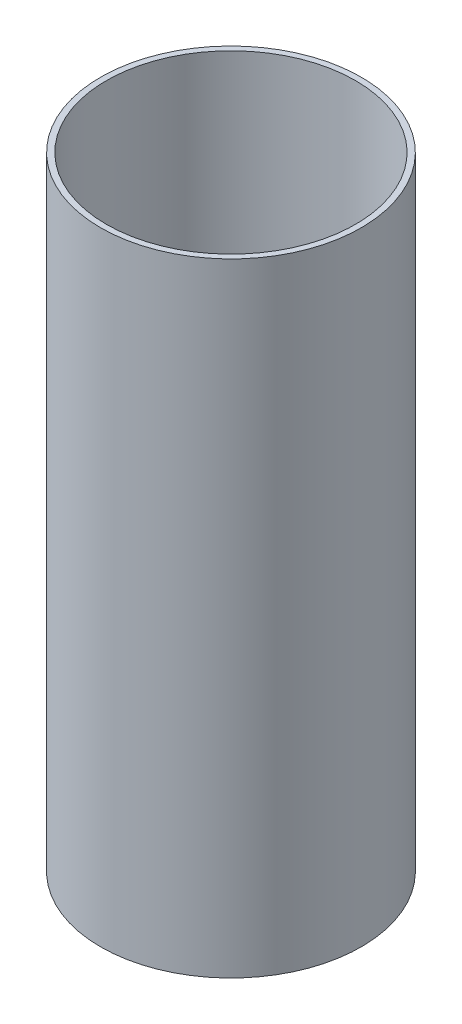
ISO-10303-21;
HEADER;
FILE_DESCRIPTION(('STEP AP214'),'2;1');
FILE_NAME('part.step','',(''),(''),'','','');
FILE_SCHEMA(('AUTOMOTIVE_DESIGN { 1 0 10303 214 1 1 1 1 }'));
ENDSEC;
DATA;
#1=APPLICATION_CONTEXT('core data for automotive mechanical design processes');
#2=APPLICATION_PROTOCOL_DEFINITION('international standard','automotive_design',2000,#1);
#3=PRODUCT_CONTEXT('',#1,'mechanical');
#4=PRODUCT('Part','Part','',(#3));
#5=PRODUCT_RELATED_PRODUCT_CATEGORY('part','',(#4));
#6=PRODUCT_DEFINITION_FORMATION('','',#4);
#7=PRODUCT_DEFINITION_CONTEXT('part definition',#1,'design');
#8=PRODUCT_DEFINITION('design','',#6,#7);
#9=PRODUCT_DEFINITION_SHAPE('','',#8);
#10=(LENGTH_UNIT() NAMED_UNIT(*) SI_UNIT(.MILLI.,.METRE.));
#11=(NAMED_UNIT(*) PLANE_ANGLE_UNIT() SI_UNIT($,.RADIAN.));
#12=(NAMED_UNIT(*) SI_UNIT($,.STERADIAN.) SOLID_ANGLE_UNIT());
#13=UNCERTAINTY_MEASURE_WITH_UNIT(LENGTH_MEASURE(1.E-05),#10,'distance_accuracy_value','');
#14=(GEOMETRIC_REPRESENTATION_CONTEXT(3) GLOBAL_UNCERTAINTY_ASSIGNED_CONTEXT((#13)) GLOBAL_UNIT_ASSIGNED_CONTEXT((#10,
#11,#12)) REPRESENTATION_CONTEXT('',''));
#15=CARTESIAN_POINT('',(0.,0.,0.));
#16=DIRECTION('',(0.,0.,1.));
#17=DIRECTION('',(1.,0.,0.));
#18=AXIS2_PLACEMENT_3D('',#15,#16,#17);
#19=CARTESIAN_POINT('',(0.,80.,0.));
#20=DIRECTION('',(0.,1.,0.));
#21=DIRECTION('',(0.,0.,1.));
#22=AXIS2_PLACEMENT_3D('',#19,#20,#21);
#23=PLANE('',#22);
#24=CARTESIAN_POINT('',(0.,80.,0.));
#25=DIRECTION('',(0.,1.,0.));
#26=DIRECTION('',(0.,0.,1.));
#27=AXIS2_PLACEMENT_3D('',#24,#25,#26);
#28=CIRCLE('',#27,16.75);
#29=CARTESIAN_POINT('',(0.,80.,16.75));
#30=VERTEX_POINT('',#29);
#31=EDGE_CURVE('E10',#30,#30,#28,.T.);
#32=ORIENTED_EDGE('',*,*,#31,.T.);
#33=EDGE_LOOP('',(#32));
#34=FACE_BOUND('',#33,.T.);
#35=CARTESIAN_POINT('',(0.,80.,0.));
#36=DIRECTION('',(0.,1.,0.));
#37=DIRECTION('',(0.,0.,1.));
#38=AXIS2_PLACEMENT_3D('',#35,#36,#37);
#39=CIRCLE('',#38,16.);
#40=CARTESIAN_POINT('',(0.,80.,16.));
#41=VERTEX_POINT('',#40);
#42=EDGE_CURVE('E41',#41,#41,#39,.T.);
#43=ORIENTED_EDGE('',*,*,#42,.F.);
#44=EDGE_LOOP('',(#43));
#45=FACE_BOUND('',#44,.T.);
#46=ADVANCED_FACE('F30',(#34,#45),#23,.T.);
#47=CARTESIAN_POINT('',(0.,0.,0.));
#48=DIRECTION('',(0.,1.,0.));
#49=DIRECTION('',(0.,0.,1.));
#50=AXIS2_PLACEMENT_3D('',#47,#48,#49);
#51=PLANE('',#50);
#52=CARTESIAN_POINT('',(0.,0.,0.));
#53=DIRECTION('',(0.,1.,0.));
#54=DIRECTION('',(0.,0.,1.));
#55=AXIS2_PLACEMENT_3D('',#52,#53,#54);
#56=CIRCLE('',#55,16.75);
#57=CARTESIAN_POINT('',(0.,0.,16.75));
#58=VERTEX_POINT('',#57);
#59=EDGE_CURVE('E34',#58,#58,#56,.T.);
#60=ORIENTED_EDGE('',*,*,#59,.F.);
#61=EDGE_LOOP('',(#60));
#62=FACE_BOUND('',#61,.T.);
#63=CARTESIAN_POINT('',(0.,0.,0.));
#64=DIRECTION('',(0.,1.,0.));
#65=DIRECTION('',(0.,0.,1.));
#66=AXIS2_PLACEMENT_3D('',#63,#64,#65);
#67=CIRCLE('',#66,16.);
#68=CARTESIAN_POINT('',(0.,0.,16.));
#69=VERTEX_POINT('',#68);
#70=EDGE_CURVE('E43',#69,#69,#67,.T.);
#71=ORIENTED_EDGE('',*,*,#70,.T.);
#72=EDGE_LOOP('',(#71));
#73=FACE_BOUND('',#72,.T.);
#74=ADVANCED_FACE('F53',(#62,#73),#51,.F.);
#75=CARTESIAN_POINT('',(0.,80.,0.));
#76=DIRECTION('',(0.,-1.,0.));
#77=DIRECTION('',(0.,0.,-1.));
#78=AXIS2_PLACEMENT_3D('',#75,#76,#77);
#79=CYLINDRICAL_SURFACE('',#78,16.75);
#80=ORIENTED_EDGE('',*,*,#31,.F.);
#81=EDGE_LOOP('',(#80));
#82=FACE_BOUND('',#81,.T.);
#83=ORIENTED_EDGE('',*,*,#59,.T.);
#84=EDGE_LOOP('',(#83));
#85=FACE_BOUND('',#84,.T.);
#86=ADVANCED_FACE('F32',(#82,#85),#79,.T.);
#87=CARTESIAN_POINT('',(0.,80.,0.));
#88=DIRECTION('',(0.,-1.,0.));
#89=DIRECTION('',(0.,0.,-1.));
#90=AXIS2_PLACEMENT_3D('',#87,#88,#89);
#91=CYLINDRICAL_SURFACE('',#90,16.);
#92=ORIENTED_EDGE('',*,*,#42,.T.);
#93=EDGE_LOOP('',(#92));
#94=FACE_BOUND('',#93,.T.);
#95=ORIENTED_EDGE('',*,*,#70,.F.);
#96=EDGE_LOOP('',(#95));
#97=FACE_BOUND('',#96,.T.);
#98=ADVANCED_FACE('F49',(#94,#97),#91,.F.);
#99=CLOSED_SHELL('',(#46,#74,#86,#98));
#100=MANIFOLD_SOLID_BREP('B2',#99);
#101=ADVANCED_BREP_SHAPE_REPRESENTATION('',(#18,#100),#14);
#102=SHAPE_DEFINITION_REPRESENTATION(#9,#101);
ENDSEC;
END-ISO-10303-21;
